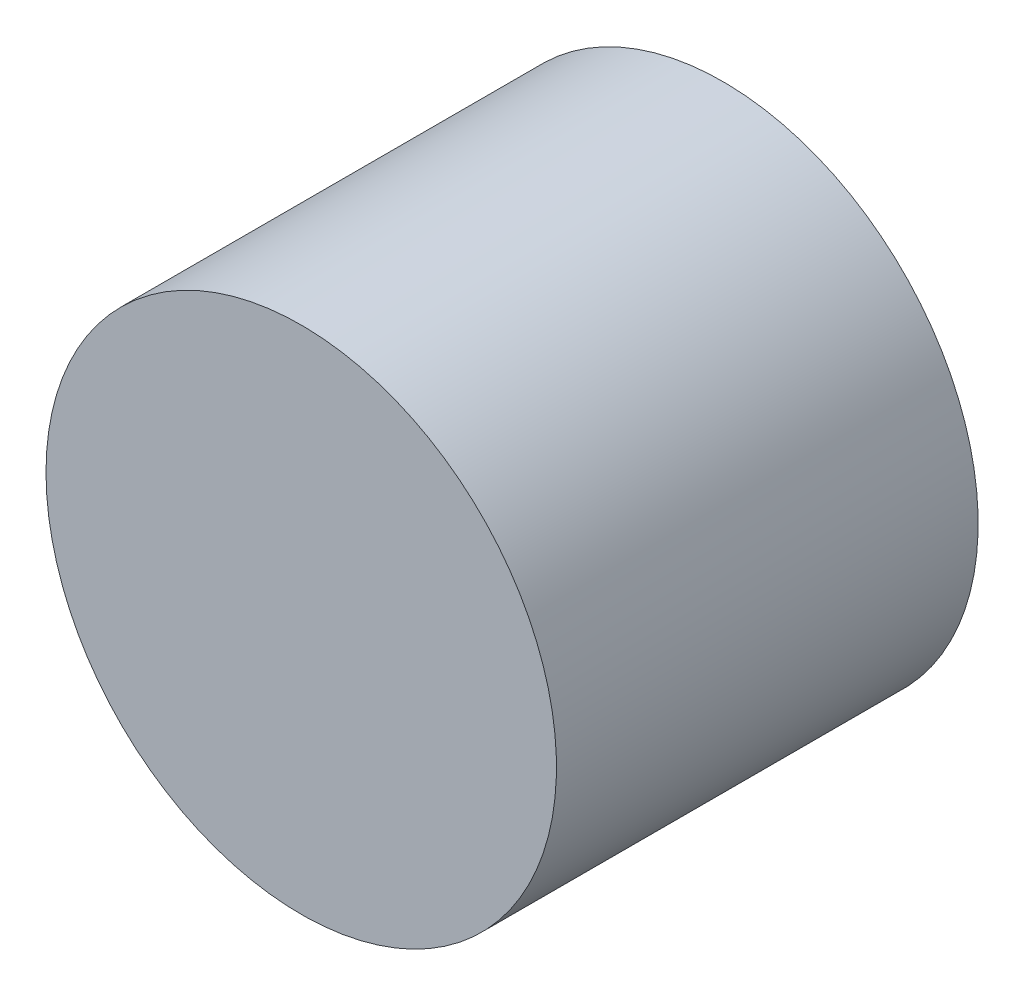
ISO-10303-21;
HEADER;
FILE_DESCRIPTION(('STEP AP214'),'2;1');
FILE_NAME('part.step','',(''),(''),'','','');
FILE_SCHEMA(('AUTOMOTIVE_DESIGN { 1 0 10303 214 1 1 1 1 }'));
ENDSEC;
DATA;
#1=APPLICATION_CONTEXT('core data for automotive mechanical design processes');
#2=APPLICATION_PROTOCOL_DEFINITION('international standard','automotive_design',2000,#1);
#3=PRODUCT_CONTEXT('',#1,'mechanical');
#4=PRODUCT('Part','Part','',(#3));
#5=PRODUCT_RELATED_PRODUCT_CATEGORY('part','',(#4));
#6=PRODUCT_DEFINITION_FORMATION('','',#4);
#7=PRODUCT_DEFINITION_CONTEXT('part definition',#1,'design');
#8=PRODUCT_DEFINITION('design','',#6,#7);
#9=PRODUCT_DEFINITION_SHAPE('','',#8);
#10=(LENGTH_UNIT() NAMED_UNIT(*) SI_UNIT(.MILLI.,.METRE.));
#11=(NAMED_UNIT(*) PLANE_ANGLE_UNIT() SI_UNIT($,.RADIAN.));
#12=(NAMED_UNIT(*) SI_UNIT($,.STERADIAN.) SOLID_ANGLE_UNIT());
#13=UNCERTAINTY_MEASURE_WITH_UNIT(LENGTH_MEASURE(1.E-05),#10,'distance_accuracy_value','');
#14=(GEOMETRIC_REPRESENTATION_CONTEXT(3) GLOBAL_UNCERTAINTY_ASSIGNED_CONTEXT((#13)) GLOBAL_UNIT_ASSIGNED_CONTEXT((#10,
#11,#12)) REPRESENTATION_CONTEXT('',''));
#15=CARTESIAN_POINT('',(0.,0.,0.));
#16=DIRECTION('',(0.,0.,1.));
#17=DIRECTION('',(1.,0.,0.));
#18=AXIS2_PLACEMENT_3D('',#15,#16,#17);
#19=CARTESIAN_POINT('',(0.,0.,3.8));
#20=DIRECTION('',(0.,0.,-1.));
#21=DIRECTION('',(-1.,0.,0.));
#22=AXIS2_PLACEMENT_3D('',#19,#20,#21);
#23=CYLINDRICAL_SURFACE('',#22,2.3);
#24=CARTESIAN_POINT('',(0.,0.,3.8));
#25=DIRECTION('',(0.,0.,1.));
#26=DIRECTION('',(1.,0.,0.));
#27=AXIS2_PLACEMENT_3D('',#24,#25,#26);
#28=CIRCLE('',#27,2.3);
#29=CARTESIAN_POINT('',(-2.3,0.,3.8));
#30=VERTEX_POINT('',#29);
#31=EDGE_CURVE('E10',#30,#30,#28,.T.);
#32=CARTESIAN_POINT('',(0.,0.,0.));
#33=DIRECTION('',(0.,0.,1.));
#34=DIRECTION('',(1.,0.,0.));
#35=AXIS2_PLACEMENT_3D('',#32,#33,#34);
#36=CIRCLE('',#35,2.3);
#37=CARTESIAN_POINT('',(-2.3,0.,0.));
#38=VERTEX_POINT('',#37);
#39=EDGE_CURVE('E39',#38,#38,#36,.T.);
#40=CARTESIAN_POINT('',(-2.3,0.,3.8));
#41=CARTESIAN_POINT('',(-2.3,0.,3.76041666666667));
#42=CARTESIAN_POINT('',(-2.3,0.,3.72083333333333));
#43=CARTESIAN_POINT('',(-2.3,0.,3.64166666666667));
#44=CARTESIAN_POINT('',(-2.3,0.,3.60208333333333));
#45=CARTESIAN_POINT('',(-2.3,0.,3.52291666666667));
#46=CARTESIAN_POINT('',(-2.3,0.,3.48333333333333));
#47=CARTESIAN_POINT('',(-2.3,0.,3.40416666666667));
#48=CARTESIAN_POINT('',(-2.3,0.,3.36458333333333));
#49=CARTESIAN_POINT('',(-2.3,0.,3.28541666666667));
#50=CARTESIAN_POINT('',(-2.3,0.,3.24583333333333));
#51=CARTESIAN_POINT('',(-2.3,0.,3.16666666666667));
#52=CARTESIAN_POINT('',(-2.3,0.,3.12708333333333));
#53=CARTESIAN_POINT('',(-2.3,0.,3.04791666666667));
#54=CARTESIAN_POINT('',(-2.3,0.,3.00833333333333));
#55=CARTESIAN_POINT('',(-2.3,0.,2.92916666666667));
#56=CARTESIAN_POINT('',(-2.3,0.,2.88958333333333));
#57=CARTESIAN_POINT('',(-2.3,0.,2.81041666666667));
#58=CARTESIAN_POINT('',(-2.3,0.,2.77083333333333));
#59=CARTESIAN_POINT('',(-2.3,0.,2.69166666666667));
#60=CARTESIAN_POINT('',(-2.3,0.,2.65208333333333));
#61=CARTESIAN_POINT('',(-2.3,0.,2.57291666666667));
#62=CARTESIAN_POINT('',(-2.3,0.,2.53333333333333));
#63=CARTESIAN_POINT('',(-2.3,0.,2.45416666666667));
#64=CARTESIAN_POINT('',(-2.3,0.,2.41458333333333));
#65=CARTESIAN_POINT('',(-2.3,0.,2.33541666666667));
#66=CARTESIAN_POINT('',(-2.3,0.,2.29583333333333));
#67=CARTESIAN_POINT('',(-2.3,0.,2.21666666666667));
#68=CARTESIAN_POINT('',(-2.3,0.,2.17708333333333));
#69=CARTESIAN_POINT('',(-2.3,0.,2.09791666666667));
#70=CARTESIAN_POINT('',(-2.3,0.,2.05833333333333));
#71=CARTESIAN_POINT('',(-2.3,0.,1.97916666666667));
#72=CARTESIAN_POINT('',(-2.3,0.,1.93958333333333));
#73=CARTESIAN_POINT('',(-2.3,0.,1.86041666666667));
#74=CARTESIAN_POINT('',(-2.3,0.,1.82083333333333));
#75=CARTESIAN_POINT('',(-2.3,0.,1.74166666666667));
#76=CARTESIAN_POINT('',(-2.3,0.,1.70208333333333));
#77=CARTESIAN_POINT('',(-2.3,0.,1.62291666666667));
#78=CARTESIAN_POINT('',(-2.3,0.,1.58333333333333));
#79=CARTESIAN_POINT('',(-2.3,0.,1.50416666666667));
#80=CARTESIAN_POINT('',(-2.3,0.,1.46458333333333));
#81=CARTESIAN_POINT('',(-2.3,0.,1.38541666666667));
#82=CARTESIAN_POINT('',(-2.3,0.,1.34583333333333));
#83=CARTESIAN_POINT('',(-2.3,0.,1.26666666666667));
#84=CARTESIAN_POINT('',(-2.3,0.,1.22708333333333));
#85=CARTESIAN_POINT('',(-2.3,0.,1.14791666666667));
#86=CARTESIAN_POINT('',(-2.3,0.,1.10833333333333));
#87=CARTESIAN_POINT('',(-2.3,0.,1.02916666666667));
#88=CARTESIAN_POINT('',(-2.3,0.,0.989583333333334));
#89=CARTESIAN_POINT('',(-2.3,0.,0.910416666666667));
#90=CARTESIAN_POINT('',(-2.3,0.,0.870833333333333));
#91=CARTESIAN_POINT('',(-2.3,0.,0.791666666666667));
#92=CARTESIAN_POINT('',(-2.3,0.,0.752083333333333));
#93=CARTESIAN_POINT('',(-2.3,0.,0.672916666666667));
#94=CARTESIAN_POINT('',(-2.3,0.,0.633333333333333));
#95=CARTESIAN_POINT('',(-2.3,0.,0.554166666666667));
#96=CARTESIAN_POINT('',(-2.3,0.,0.514583333333334));
#97=CARTESIAN_POINT('',(-2.3,0.,0.435416666666667));
#98=CARTESIAN_POINT('',(-2.3,0.,0.395833333333334));
#99=CARTESIAN_POINT('',(-2.3,0.,0.316666666666667));
#100=CARTESIAN_POINT('',(-2.3,0.,0.277083333333333));
#101=CARTESIAN_POINT('',(-2.3,0.,0.197916666666667));
#102=CARTESIAN_POINT('',(-2.3,0.,0.158333333333333));
#103=CARTESIAN_POINT('',(-2.3,0.,0.0791666666666666));
#104=CARTESIAN_POINT('',(-2.3,0.,0.0395833333333333));
#105=CARTESIAN_POINT('',(-2.3,0.,0.));
#106=B_SPLINE_CURVE_WITH_KNOTS('',3,(#40,#41,#42,#43,#44,#45,#46,#47,#48,#49,#50,#51,#52,#53,
#54,#55,#56,#57,#58,#59,#60,#61,#62,#63,#64,#65,#66,#67,#68,#69,#70,#71,#72,#73,#74,#75,#76,#77,
#78,#79,#80,#81,#82,#83,#84,#85,#86,#87,#88,#89,#90,#91,#92,#93,#94,#95,#96,#97,#98,#99,#100,
#101,#102,#103,#104,#105),.UNSPECIFIED.,.F.,.F.,(4,2,2,2,2,2,2,2,2,2,2,2,2,2,2,2,2,2,2,2,2,2,2,
2,2,2,2,2,2,2,2,2,4),(0.,0.11875,0.2375,0.35625,0.475,0.59375,0.7125,0.83125,0.95,1.06875,
1.1875,1.30625,1.425,1.54375,1.6625,1.78125,1.9,2.01875,2.1375,2.25625,2.375,2.49375,2.6125,
2.73125,2.85,2.96875,3.0875,3.20625,3.325,3.44375,3.5625,3.68125,3.8),.UNSPECIFIED.);
#107=EDGE_CURVE('BSEAM36',#30,#38,#106,.T.);
#108=ORIENTED_EDGE('',*,*,#31,.F.);
#109=ORIENTED_EDGE('',*,*,#39,.T.);
#110=ORIENTED_EDGE('',*,*,#107,.T.);
#111=ORIENTED_EDGE('',*,*,#107,.F.);
#112=EDGE_LOOP('',(#108,#110,#109,#111));
#113=FACE_BOUND('',#112,.T.);
#114=ADVANCED_FACE('F36',(#113),#23,.T.);
#115=CARTESIAN_POINT('',(0.,0.,3.8));
#116=DIRECTION('',(0.,0.,1.));
#117=DIRECTION('',(1.,0.,0.));
#118=AXIS2_PLACEMENT_3D('',#115,#116,#117);
#119=PLANE('',#118);
#120=ORIENTED_EDGE('',*,*,#31,.T.);
#121=EDGE_LOOP('',(#120));
#122=FACE_BOUND('',#121,.T.);
#123=ADVANCED_FACE('F51',(#122),#119,.T.);
#124=CARTESIAN_POINT('',(0.,0.,0.));
#125=DIRECTION('',(0.,0.,1.));
#126=DIRECTION('',(1.,0.,0.));
#127=AXIS2_PLACEMENT_3D('',#124,#125,#126);
#128=PLANE('',#127);
#129=ORIENTED_EDGE('',*,*,#39,.F.);
#130=EDGE_LOOP('',(#129));
#131=FACE_BOUND('',#130,.T.);
#132=ADVANCED_FACE('F49',(#131),#128,.F.);
#133=CLOSED_SHELL('',(#114,#123,#132));
#134=MANIFOLD_SOLID_BREP('B2',#133);
#135=ADVANCED_BREP_SHAPE_REPRESENTATION('',(#18,#134),#14);
#136=SHAPE_DEFINITION_REPRESENTATION(#9,#135);
ENDSEC;
END-ISO-10303-21;
